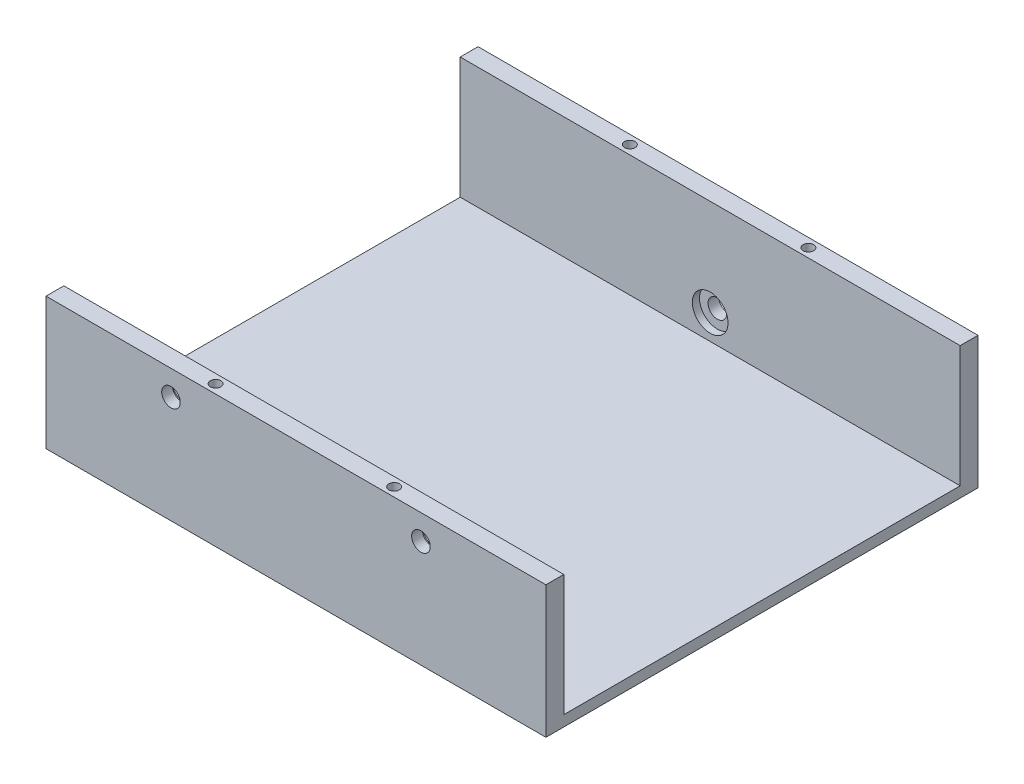
ISO-10303-21;
HEADER;
FILE_DESCRIPTION(('STEP AP214'),'2;1');
FILE_NAME('part.step','',(''),(''),'','','');
FILE_SCHEMA(('AUTOMOTIVE_DESIGN { 1 0 10303 214 1 1 1 1 }'));
ENDSEC;
DATA;
#1=APPLICATION_CONTEXT('core data for automotive mechanical design processes');
#2=APPLICATION_PROTOCOL_DEFINITION('international standard','automotive_design',2000,#1);
#3=PRODUCT_CONTEXT('',#1,'mechanical');
#4=PRODUCT('Part','Part','',(#3));
#5=PRODUCT_RELATED_PRODUCT_CATEGORY('part','',(#4));
#6=PRODUCT_DEFINITION_FORMATION('','',#4);
#7=PRODUCT_DEFINITION_CONTEXT('part definition',#1,'design');
#8=PRODUCT_DEFINITION('design','',#6,#7);
#9=PRODUCT_DEFINITION_SHAPE('','',#8);
#10=(LENGTH_UNIT() NAMED_UNIT(*) SI_UNIT(.MILLI.,.METRE.));
#11=(NAMED_UNIT(*) PLANE_ANGLE_UNIT() SI_UNIT($,.RADIAN.));
#12=(NAMED_UNIT(*) SI_UNIT($,.STERADIAN.) SOLID_ANGLE_UNIT());
#13=UNCERTAINTY_MEASURE_WITH_UNIT(LENGTH_MEASURE(1.E-05),#10,'distance_accuracy_value','');
#14=(GEOMETRIC_REPRESENTATION_CONTEXT(3) GLOBAL_UNCERTAINTY_ASSIGNED_CONTEXT((#13)) GLOBAL_UNIT_ASSIGNED_CONTEXT((#10,
#11,#12)) REPRESENTATION_CONTEXT('',''));
#15=CARTESIAN_POINT('',(0.,0.,0.));
#16=DIRECTION('',(0.,0.,1.));
#17=DIRECTION('',(1.,0.,0.));
#18=AXIS2_PLACEMENT_3D('',#15,#16,#17);
#19=CARTESIAN_POINT('',(150.,40.,-6.));
#20=DIRECTION('',(0.,0.,1.));
#21=DIRECTION('',(1.,0.,0.));
#22=AXIS2_PLACEMENT_3D('',#19,#20,#21);
#23=PLANE('',#22);
#24=CARTESIAN_POINT('',(35.,30.,-5.99999999999999));
#25=DIRECTION('',(0.,0.,-1.));
#26=DIRECTION('',(-1.,0.,0.));
#27=AXIS2_PLACEMENT_3D('',#24,#25,#26);
#28=CIRCLE('',#27,5.);
#29=CARTESIAN_POINT('',(30.,30.,-5.99999999999998));
#30=VERTEX_POINT('',#29);
#31=EDGE_CURVE('E175',#30,#30,#28,.T.);
#32=ORIENTED_EDGE('',*,*,#31,.F.);
#33=EDGE_LOOP('',(#32));
#34=FACE_BOUND('',#33,.T.);
#35=CARTESIAN_POINT('',(105.,30.,-5.99999999999999));
#36=DIRECTION('',(0.,0.,-1.));
#37=DIRECTION('',(-1.,0.,0.));
#38=AXIS2_PLACEMENT_3D('',#35,#36,#37);
#39=CIRCLE('',#38,5.00000000000001);
#40=CARTESIAN_POINT('',(100.,30.,-5.99999999999999));
#41=VERTEX_POINT('',#40);
#42=EDGE_CURVE('E176',#41,#41,#39,.T.);
#43=ORIENTED_EDGE('',*,*,#42,.F.);
#44=EDGE_LOOP('',(#43));
#45=FACE_BOUND('',#44,.T.);
#46=DIRECTION('',(-1.,0.,0.));
#47=VECTOR('',#46,1.);
#48=CARTESIAN_POINT('',(150.,3.,-6.));
#49=LINE('',#48,#47);
#50=CARTESIAN_POINT('',(140.,3.,-6.));
#51=VERTEX_POINT('',#50);
#52=CARTESIAN_POINT('',(0.,3.,-5.99999999999999));
#53=VERTEX_POINT('',#52);
#54=EDGE_CURVE('E104',#51,#53,#49,.T.);
#55=ORIENTED_EDGE('',*,*,#54,.T.);
#56=DIRECTION('',(0.,1.,0.));
#57=VECTOR('',#56,1.);
#58=CARTESIAN_POINT('',(0.,3.,-5.99999999999999));
#59=LINE('',#58,#57);
#60=CARTESIAN_POINT('',(0.,37.,-6.));
#61=VERTEX_POINT('',#60);
#62=EDGE_CURVE('E107',#53,#61,#59,.T.);
#63=ORIENTED_EDGE('',*,*,#62,.T.);
#64=DIRECTION('',(1.,0.,0.));
#65=VECTOR('',#64,1.);
#66=CARTESIAN_POINT('',(0.,37.,-6.));
#67=LINE('',#66,#65);
#68=CARTESIAN_POINT('',(140.,37.,-6.));
#69=VERTEX_POINT('',#68);
#70=EDGE_CURVE('E55',#61,#69,#67,.T.);
#71=ORIENTED_EDGE('',*,*,#70,.T.);
#72=DIRECTION('',(0.,-1.,0.));
#73=VECTOR('',#72,1.);
#74=CARTESIAN_POINT('',(140.,40.,-6.));
#75=LINE('',#74,#73);
#76=EDGE_CURVE('E110',#69,#51,#75,.T.);
#77=ORIENTED_EDGE('',*,*,#76,.T.);
#78=EDGE_LOOP('',(#55,#63,#71,#77));
#79=FACE_BOUND('',#78,.T.);
#80=ADVANCED_FACE('F40',(#34,#45,#79),#23,.F.);
#81=CARTESIAN_POINT('',(70.,10.,-123.));
#82=DIRECTION('',(0.,0.,1.));
#83=DIRECTION('',(1.,0.,0.));
#84=AXIS2_PLACEMENT_3D('',#81,#82,#83);
#85=CYLINDRICAL_SURFACE('',#84,2.6);
#86=CARTESIAN_POINT('',(70.,10.,-122.));
#87=DIRECTION('',(0.,0.,1.));
#88=DIRECTION('',(1.,0.,0.));
#89=AXIS2_PLACEMENT_3D('',#86,#87,#88);
#90=CIRCLE('',#89,2.6);
#91=CARTESIAN_POINT('',(72.6,10.,-122.));
#92=VERTEX_POINT('',#91);
#93=EDGE_CURVE('E156',#92,#92,#90,.F.);
#94=ORIENTED_EDGE('',*,*,#93,.T.);
#95=EDGE_LOOP('',(#94));
#96=FACE_BOUND('',#95,.T.);
#97=CARTESIAN_POINT('',(70.,10.,-119.));
#98=DIRECTION('',(0.,0.,1.));
#99=DIRECTION('',(1.,0.,0.));
#100=AXIS2_PLACEMENT_3D('',#97,#98,#99);
#101=CIRCLE('',#100,2.6);
#102=CARTESIAN_POINT('',(72.6,10.,-119.));
#103=VERTEX_POINT('',#102);
#104=EDGE_CURVE('E238',#103,#103,#101,.T.);
#105=ORIENTED_EDGE('',*,*,#104,.T.);
#106=EDGE_LOOP('',(#105));
#107=FACE_BOUND('',#106,.T.);
#108=ADVANCED_FACE('F221',(#96,#107),#85,.F.);
#109=CARTESIAN_POINT('',(35.,30.,31.));
#110=DIRECTION('',(0.,0.,-1.));
#111=DIRECTION('',(-1.,0.,0.));
#112=AXIS2_PLACEMENT_3D('',#109,#110,#111);
#113=CYLINDRICAL_SURFACE('',#112,2.6);
#114=CARTESIAN_POINT('',(35.,30.,-1.));
#115=DIRECTION('',(0.,0.,-1.));
#116=DIRECTION('',(-1.,0.,0.));
#117=AXIS2_PLACEMENT_3D('',#114,#115,#116);
#118=CIRCLE('',#117,2.6);
#119=CARTESIAN_POINT('',(32.4,30.,-1.));
#120=VERTEX_POINT('',#119);
#121=EDGE_CURVE('E143',#120,#120,#118,.F.);
#122=ORIENTED_EDGE('',*,*,#121,.T.);
#123=EDGE_LOOP('',(#122));
#124=FACE_BOUND('',#123,.T.);
#125=CARTESIAN_POINT('',(35.,30.,-3.99999999999998));
#126=DIRECTION('',(0.,0.,-1.));
#127=DIRECTION('',(-1.,0.,0.));
#128=AXIS2_PLACEMENT_3D('',#125,#126,#127);
#129=CIRCLE('',#128,2.6);
#130=CARTESIAN_POINT('',(32.4,30.,-3.99999999999998));
#131=VERTEX_POINT('',#130);
#132=EDGE_CURVE('E225',#131,#131,#129,.T.);
#133=ORIENTED_EDGE('',*,*,#132,.T.);
#134=EDGE_LOOP('',(#133));
#135=FACE_BOUND('',#134,.T.);
#136=ADVANCED_FACE('F217',(#124,#135),#113,.F.);
#137=CARTESIAN_POINT('',(105.,30.,31.));
#138=DIRECTION('',(0.,0.,-1.));
#139=DIRECTION('',(-1.,0.,0.));
#140=AXIS2_PLACEMENT_3D('',#137,#138,#139);
#141=CYLINDRICAL_SURFACE('',#140,2.6);
#142=CARTESIAN_POINT('',(105.,30.,-0.999999999999997));
#143=DIRECTION('',(0.,0.,-1.));
#144=DIRECTION('',(-1.,0.,0.));
#145=AXIS2_PLACEMENT_3D('',#142,#143,#144);
#146=CIRCLE('',#145,2.6);
#147=CARTESIAN_POINT('',(102.4,30.,-0.999999999999997));
#148=VERTEX_POINT('',#147);
#149=EDGE_CURVE('E140',#148,#148,#146,.F.);
#150=ORIENTED_EDGE('',*,*,#149,.T.);
#151=EDGE_LOOP('',(#150));
#152=FACE_BOUND('',#151,.T.);
#153=CARTESIAN_POINT('',(105.,30.,-3.99999999999999));
#154=DIRECTION('',(0.,0.,-1.));
#155=DIRECTION('',(-1.,0.,0.));
#156=AXIS2_PLACEMENT_3D('',#153,#154,#155);
#157=CIRCLE('',#156,2.6);
#158=CARTESIAN_POINT('',(102.4,30.,-3.99999999999999));
#159=VERTEX_POINT('',#158);
#160=EDGE_CURVE('E230',#159,#159,#157,.T.);
#161=ORIENTED_EDGE('',*,*,#160,.T.);
#162=EDGE_LOOP('',(#161));
#163=FACE_BOUND('',#162,.T.);
#164=ADVANCED_FACE('F220',(#152,#163),#141,.F.);
#165=CARTESIAN_POINT('',(0.,3.,0.));
#166=DIRECTION('',(0.,1.,0.));
#167=DIRECTION('',(0.,0.,1.));
#168=AXIS2_PLACEMENT_3D('',#165,#166,#167);
#169=PLANE('',#168);
#170=DIRECTION('',(0.,0.,-1.));
#171=VECTOR('',#170,1.);
#172=CARTESIAN_POINT('',(0.,3.,0.));
#173=LINE('',#172,#171);
#174=CARTESIAN_POINT('',(0.,3.,-117.));
#175=VERTEX_POINT('',#174);
#176=EDGE_CURVE('E11',#53,#175,#173,.T.);
#177=ORIENTED_EDGE('',*,*,#176,.F.);
#178=ORIENTED_EDGE('',*,*,#54,.F.);
#179=DIRECTION('',(0.,0.,1.));
#180=VECTOR('',#179,1.);
#181=CARTESIAN_POINT('',(140.,3.,0.));
#182=LINE('',#181,#180);
#183=CARTESIAN_POINT('',(140.,3.,-117.));
#184=VERTEX_POINT('',#183);
#185=EDGE_CURVE('E184',#184,#51,#182,.T.);
#186=ORIENTED_EDGE('',*,*,#185,.F.);
#187=DIRECTION('',(1.,0.,0.));
#188=VECTOR('',#187,1.);
#189=CARTESIAN_POINT('',(0.,3.,-117.));
#190=LINE('',#189,#188);
#191=EDGE_CURVE('E114',#175,#184,#190,.T.);
#192=ORIENTED_EDGE('',*,*,#191,.F.);
#193=EDGE_LOOP('',(#177,#178,#186,#192));
#194=FACE_BOUND('',#193,.T.);
#195=ADVANCED_FACE('F118',(#194),#169,.T.);
#196=CARTESIAN_POINT('',(0.,3.,0.));
#197=DIRECTION('',(-1.,0.,0.));
#198=DIRECTION('',(0.,0.,1.));
#199=AXIS2_PLACEMENT_3D('',#196,#197,#198);
#200=PLANE('',#199);
#201=ORIENTED_EDGE('',*,*,#62,.F.);
#202=ORIENTED_EDGE('',*,*,#176,.T.);
#203=DIRECTION('',(0.,-1.,0.));
#204=VECTOR('',#203,1.);
#205=CARTESIAN_POINT('',(0.,20.,-117.));
#206=LINE('',#205,#204);
#207=CARTESIAN_POINT('',(0.,37.,-117.));
#208=VERTEX_POINT('',#207);
#209=EDGE_CURVE('E188',#208,#175,#206,.T.);
#210=ORIENTED_EDGE('',*,*,#209,.F.);
#211=DIRECTION('',(0.,0.,1.));
#212=VECTOR('',#211,1.);
#213=CARTESIAN_POINT('',(0.,37.,-123.));
#214=LINE('',#213,#212);
#215=CARTESIAN_POINT('',(0.,37.,-122.));
#216=VERTEX_POINT('',#215);
#217=EDGE_CURVE('E159',#216,#208,#214,.T.);
#218=ORIENTED_EDGE('',*,*,#217,.F.);
#219=DIRECTION('',(0.,1.,0.));
#220=VECTOR('',#219,1.);
#221=CARTESIAN_POINT('',(0.,-13.,-122.));
#222=LINE('',#221,#220);
#223=CARTESIAN_POINT('',(0.,0.,-122.));
#224=VERTEX_POINT('',#223);
#225=EDGE_CURVE('E148',#224,#216,#222,.T.);
#226=ORIENTED_EDGE('',*,*,#225,.F.);
#227=DIRECTION('',(0.,0.,-1.));
#228=VECTOR('',#227,1.);
#229=CARTESIAN_POINT('',(0.,0.,0.));
#230=LINE('',#229,#228);
#231=CARTESIAN_POINT('',(0.,0.,-1.));
#232=VERTEX_POINT('',#231);
#233=EDGE_CURVE('E44',#232,#224,#230,.T.);
#234=ORIENTED_EDGE('',*,*,#233,.F.);
#235=DIRECTION('',(0.,1.,0.));
#236=VECTOR('',#235,1.);
#237=CARTESIAN_POINT('',(0.,-13.,-1.));
#238=LINE('',#237,#236);
#239=CARTESIAN_POINT('',(0.,37.,-1.));
#240=VERTEX_POINT('',#239);
#241=EDGE_CURVE('E134',#232,#240,#238,.T.);
#242=ORIENTED_EDGE('',*,*,#241,.T.);
#243=DIRECTION('',(0.,0.,1.));
#244=VECTOR('',#243,1.);
#245=CARTESIAN_POINT('',(0.,37.,-6.));
#246=LINE('',#245,#244);
#247=EDGE_CURVE('E124',#61,#240,#246,.T.);
#248=ORIENTED_EDGE('',*,*,#247,.F.);
#249=EDGE_LOOP('',(#201,#202,#210,#218,#226,#234,#242,#248));
#250=FACE_BOUND('',#249,.T.);
#251=ADVANCED_FACE('F42',(#250),#200,.T.);
#252=CARTESIAN_POINT('',(0.,0.,0.));
#253=DIRECTION('',(0.,1.,0.));
#254=DIRECTION('',(0.,0.,1.));
#255=AXIS2_PLACEMENT_3D('',#252,#253,#254);
#256=PLANE('',#255);
#257=DIRECTION('',(0.,0.,-1.));
#258=VECTOR('',#257,1.);
#259=CARTESIAN_POINT('',(140.,0.,0.));
#260=LINE('',#259,#258);
#261=CARTESIAN_POINT('',(140.,0.,-1.));
#262=VERTEX_POINT('',#261);
#263=CARTESIAN_POINT('',(140.,0.,-122.));
#264=VERTEX_POINT('',#263);
#265=EDGE_CURVE('E179',#262,#264,#260,.T.);
#266=ORIENTED_EDGE('',*,*,#265,.F.);
#267=DIRECTION('',(-1.,0.,0.));
#268=VECTOR('',#267,1.);
#269=CARTESIAN_POINT('',(0.,0.,-1.));
#270=LINE('',#269,#268);
#271=EDGE_CURVE('E136',#262,#232,#270,.T.);
#272=ORIENTED_EDGE('',*,*,#271,.T.);
#273=ORIENTED_EDGE('',*,*,#233,.T.);
#274=DIRECTION('',(1.,0.,0.));
#275=VECTOR('',#274,1.);
#276=CARTESIAN_POINT('',(0.,0.,-122.));
#277=LINE('',#276,#275);
#278=EDGE_CURVE('E152',#224,#264,#277,.T.);
#279=ORIENTED_EDGE('',*,*,#278,.T.);
#280=EDGE_LOOP('',(#266,#272,#273,#279));
#281=FACE_BOUND('',#280,.T.);
#282=ADVANCED_FACE('F195',(#281),#256,.F.);
#283=CARTESIAN_POINT('',(0.,20.,-117.));
#284=DIRECTION('',(0.,0.,-1.));
#285=DIRECTION('',(-1.,0.,0.));
#286=AXIS2_PLACEMENT_3D('',#283,#284,#285);
#287=PLANE('',#286);
#288=CARTESIAN_POINT('',(70.,10.,-117.));
#289=DIRECTION('',(0.,0.,1.));
#290=DIRECTION('',(1.,0.,0.));
#291=AXIS2_PLACEMENT_3D('',#288,#289,#290);
#292=CIRCLE('',#291,5.);
#293=CARTESIAN_POINT('',(75.,10.,-117.));
#294=VERTEX_POINT('',#293);
#295=EDGE_CURVE('E171',#294,#294,#292,.T.);
#296=ORIENTED_EDGE('',*,*,#295,.F.);
#297=EDGE_LOOP('',(#296));
#298=FACE_BOUND('',#297,.T.);
#299=ORIENTED_EDGE('',*,*,#191,.T.);
#300=DIRECTION('',(0.,1.,0.));
#301=VECTOR('',#300,1.);
#302=CARTESIAN_POINT('',(140.,20.,-117.));
#303=LINE('',#302,#301);
#304=CARTESIAN_POINT('',(140.,37.,-117.));
#305=VERTEX_POINT('',#304);
#306=EDGE_CURVE('E115',#184,#305,#303,.T.);
#307=ORIENTED_EDGE('',*,*,#306,.T.);
#308=DIRECTION('',(1.,0.,0.));
#309=VECTOR('',#308,1.);
#310=CARTESIAN_POINT('',(0.,37.,-117.));
#311=LINE('',#310,#309);
#312=EDGE_CURVE('E161',#208,#305,#311,.T.);
#313=ORIENTED_EDGE('',*,*,#312,.F.);
#314=ORIENTED_EDGE('',*,*,#209,.T.);
#315=EDGE_LOOP('',(#299,#307,#313,#314));
#316=FACE_BOUND('',#315,.T.);
#317=ADVANCED_FACE('F299',(#298,#316),#287,.F.);
#318=CARTESIAN_POINT('',(140.,50.,0.));
#319=DIRECTION('',(-1.,0.,0.));
#320=DIRECTION('',(0.,0.,1.));
#321=AXIS2_PLACEMENT_3D('',#318,#319,#320);
#322=PLANE('',#321);
#323=DIRECTION('',(0.,0.,1.));
#324=VECTOR('',#323,1.);
#325=CARTESIAN_POINT('',(140.,37.,-6.));
#326=LINE('',#325,#324);
#327=CARTESIAN_POINT('',(140.,37.,-1.));
#328=VERTEX_POINT('',#327);
#329=EDGE_CURVE('E168',#69,#328,#326,.T.);
#330=ORIENTED_EDGE('',*,*,#329,.T.);
#331=DIRECTION('',(0.,1.,0.));
#332=VECTOR('',#331,1.);
#333=CARTESIAN_POINT('',(140.,-13.,-1.));
#334=LINE('',#333,#332);
#335=EDGE_CURVE('E63',#262,#328,#334,.T.);
#336=ORIENTED_EDGE('',*,*,#335,.F.);
#337=ORIENTED_EDGE('',*,*,#265,.T.);
#338=DIRECTION('',(0.,1.,0.));
#339=VECTOR('',#338,1.);
#340=CARTESIAN_POINT('',(140.,-13.,-122.));
#341=LINE('',#340,#339);
#342=CARTESIAN_POINT('',(140.,37.,-122.));
#343=VERTEX_POINT('',#342);
#344=EDGE_CURVE('E149',#264,#343,#341,.T.);
#345=ORIENTED_EDGE('',*,*,#344,.T.);
#346=DIRECTION('',(0.,0.,-1.));
#347=VECTOR('',#346,1.);
#348=CARTESIAN_POINT('',(140.,37.,-123.));
#349=LINE('',#348,#347);
#350=EDGE_CURVE('E164',#305,#343,#349,.T.);
#351=ORIENTED_EDGE('',*,*,#350,.F.);
#352=ORIENTED_EDGE('',*,*,#306,.F.);
#353=ORIENTED_EDGE('',*,*,#185,.T.);
#354=ORIENTED_EDGE('',*,*,#76,.F.);
#355=EDGE_LOOP('',(#330,#336,#337,#345,#351,#352,#353,#354));
#356=FACE_BOUND('',#355,.T.);
#357=ADVANCED_FACE('F207',(#356),#322,.F.);
#358=CARTESIAN_POINT('',(105.,30.,-2.99999999999999));
#359=DIRECTION('',(0.,0.,-1.));
#360=DIRECTION('',(-1.,0.,0.));
#361=AXIS2_PLACEMENT_3D('',#358,#359,#360);
#362=CYLINDRICAL_SURFACE('',#361,5.00000000000001);
#363=CARTESIAN_POINT('',(105.,30.,-3.99999999999999));
#364=DIRECTION('',(0.,0.,-1.));
#365=DIRECTION('',(-1.,0.,0.));
#366=AXIS2_PLACEMENT_3D('',#363,#364,#365);
#367=CIRCLE('',#366,5.00000000000001);
#368=CARTESIAN_POINT('',(100.,30.,-3.99999999999999));
#369=VERTEX_POINT('',#368);
#370=EDGE_CURVE('E235',#369,#369,#367,.T.);
#371=ORIENTED_EDGE('',*,*,#370,.F.);
#372=EDGE_LOOP('',(#371));
#373=FACE_BOUND('',#372,.T.);
#374=ORIENTED_EDGE('',*,*,#42,.T.);
#375=EDGE_LOOP('',(#374));
#376=FACE_BOUND('',#375,.T.);
#377=ADVANCED_FACE('F399',(#373,#376),#362,.F.);
#378=CARTESIAN_POINT('',(35.,30.,-2.99999999999999));
#379=DIRECTION('',(0.,0.,-1.));
#380=DIRECTION('',(-1.,0.,0.));
#381=AXIS2_PLACEMENT_3D('',#378,#379,#380);
#382=CYLINDRICAL_SURFACE('',#381,5.);
#383=CARTESIAN_POINT('',(35.,30.,-3.99999999999998));
#384=DIRECTION('',(0.,0.,-1.));
#385=DIRECTION('',(-1.,0.,0.));
#386=AXIS2_PLACEMENT_3D('',#383,#384,#385);
#387=CIRCLE('',#386,5.00000000000001);
#388=CARTESIAN_POINT('',(30.,30.,-3.99999999999998));
#389=VERTEX_POINT('',#388);
#390=EDGE_CURVE('E227',#389,#389,#387,.T.);
#391=ORIENTED_EDGE('',*,*,#390,.F.);
#392=EDGE_LOOP('',(#391));
#393=FACE_BOUND('',#392,.T.);
#394=ORIENTED_EDGE('',*,*,#31,.T.);
#395=EDGE_LOOP('',(#394));
#396=FACE_BOUND('',#395,.T.);
#397=ADVANCED_FACE('F348',(#393,#396),#382,.F.);
#398=CARTESIAN_POINT('',(70.,10.,-120.));
#399=DIRECTION('',(0.,0.,1.));
#400=DIRECTION('',(1.,0.,0.));
#401=AXIS2_PLACEMENT_3D('',#398,#399,#400);
#402=CYLINDRICAL_SURFACE('',#401,5.);
#403=CARTESIAN_POINT('',(70.,10.,-119.));
#404=DIRECTION('',(0.,0.,1.));
#405=DIRECTION('',(1.,0.,0.));
#406=AXIS2_PLACEMENT_3D('',#403,#404,#405);
#407=CIRCLE('',#406,5.);
#408=CARTESIAN_POINT('',(75.,10.,-119.));
#409=VERTEX_POINT('',#408);
#410=EDGE_CURVE('E241',#409,#409,#407,.T.);
#411=ORIENTED_EDGE('',*,*,#410,.F.);
#412=EDGE_LOOP('',(#411));
#413=FACE_BOUND('',#412,.T.);
#414=ORIENTED_EDGE('',*,*,#295,.T.);
#415=EDGE_LOOP('',(#414));
#416=FACE_BOUND('',#415,.T.);
#417=ADVANCED_FACE('F267',(#413,#416),#402,.F.);
#418=CARTESIAN_POINT('',(0.,37.,-6.));
#419=DIRECTION('',(0.,-1.,0.));
#420=DIRECTION('',(0.,0.,-1.));
#421=AXIS2_PLACEMENT_3D('',#418,#419,#420);
#422=PLANE('',#421);
#423=CARTESIAN_POINT('',(45.,37.,-3.49999999999999));
#424=DIRECTION('',(0.,1.,0.));
#425=DIRECTION('',(0.,0.,1.));
#426=AXIS2_PLACEMENT_3D('',#423,#424,#425);
#427=CIRCLE('',#426,1.48);
#428=CARTESIAN_POINT('',(45.,37.,-2.01999999999999));
#429=VERTEX_POINT('',#428);
#430=EDGE_CURVE('E248',#429,#429,#427,.T.);
#431=ORIENTED_EDGE('',*,*,#430,.F.);
#432=EDGE_LOOP('',(#431));
#433=FACE_BOUND('',#432,.T.);
#434=CARTESIAN_POINT('',(95.,37.,-3.5));
#435=DIRECTION('',(0.,1.,0.));
#436=DIRECTION('',(0.,0.,1.));
#437=AXIS2_PLACEMENT_3D('',#434,#435,#436);
#438=CIRCLE('',#437,1.47999999999999);
#439=CARTESIAN_POINT('',(95.,37.,-2.02000000000001));
#440=VERTEX_POINT('',#439);
#441=EDGE_CURVE('E244',#440,#440,#438,.T.);
#442=ORIENTED_EDGE('',*,*,#441,.F.);
#443=EDGE_LOOP('',(#442));
#444=FACE_BOUND('',#443,.T.);
#445=ORIENTED_EDGE('',*,*,#70,.F.);
#446=ORIENTED_EDGE('',*,*,#247,.T.);
#447=DIRECTION('',(-1.,0.,0.));
#448=VECTOR('',#447,1.);
#449=CARTESIAN_POINT('',(0.,37.,-1.));
#450=LINE('',#449,#448);
#451=EDGE_CURVE('E125',#328,#240,#450,.T.);
#452=ORIENTED_EDGE('',*,*,#451,.F.);
#453=ORIENTED_EDGE('',*,*,#329,.F.);
#454=EDGE_LOOP('',(#445,#446,#452,#453));
#455=FACE_BOUND('',#454,.T.);
#456=ADVANCED_FACE('F208',(#433,#444,#455),#422,.F.);
#457=CARTESIAN_POINT('',(0.,37.,0.));
#458=DIRECTION('',(0.,1.,0.));
#459=DIRECTION('',(0.,0.,1.));
#460=AXIS2_PLACEMENT_3D('',#457,#458,#459);
#461=PLANE('',#460);
#462=CARTESIAN_POINT('',(95.,37.,-119.5));
#463=DIRECTION('',(0.,1.,0.));
#464=DIRECTION('',(0.,0.,1.));
#465=AXIS2_PLACEMENT_3D('',#462,#463,#464);
#466=CIRCLE('',#465,1.47999999999999);
#467=CARTESIAN_POINT('',(95.,37.,-118.02));
#468=VERTEX_POINT('',#467);
#469=EDGE_CURVE('E254',#468,#468,#466,.T.);
#470=ORIENTED_EDGE('',*,*,#469,.F.);
#471=EDGE_LOOP('',(#470));
#472=FACE_BOUND('',#471,.T.);
#473=CARTESIAN_POINT('',(45.,37.,-119.5));
#474=DIRECTION('',(0.,1.,0.));
#475=DIRECTION('',(0.,0.,1.));
#476=AXIS2_PLACEMENT_3D('',#473,#474,#475);
#477=CIRCLE('',#476,1.48);
#478=CARTESIAN_POINT('',(45.,37.,-118.02));
#479=VERTEX_POINT('',#478);
#480=EDGE_CURVE('E130',#479,#479,#477,.T.);
#481=ORIENTED_EDGE('',*,*,#480,.F.);
#482=EDGE_LOOP('',(#481));
#483=FACE_BOUND('',#482,.T.);
#484=DIRECTION('',(1.,0.,0.));
#485=VECTOR('',#484,1.);
#486=CARTESIAN_POINT('',(0.,37.,-122.));
#487=LINE('',#486,#485);
#488=EDGE_CURVE('E146',#216,#343,#487,.T.);
#489=ORIENTED_EDGE('',*,*,#488,.F.);
#490=ORIENTED_EDGE('',*,*,#217,.T.);
#491=ORIENTED_EDGE('',*,*,#312,.T.);
#492=ORIENTED_EDGE('',*,*,#350,.T.);
#493=EDGE_LOOP('',(#489,#490,#491,#492));
#494=FACE_BOUND('',#493,.T.);
#495=ADVANCED_FACE('F204',(#472,#483,#494),#461,.T.);
#496=CARTESIAN_POINT('',(0.,-13.,-122.));
#497=DIRECTION('',(0.,0.,1.));
#498=DIRECTION('',(1.,0.,0.));
#499=AXIS2_PLACEMENT_3D('',#496,#497,#498);
#500=PLANE('',#499);
#501=ORIENTED_EDGE('',*,*,#225,.T.);
#502=ORIENTED_EDGE('',*,*,#488,.T.);
#503=ORIENTED_EDGE('',*,*,#344,.F.);
#504=ORIENTED_EDGE('',*,*,#278,.F.);
#505=EDGE_LOOP('',(#501,#502,#503,#504));
#506=FACE_BOUND('',#505,.T.);
#507=ORIENTED_EDGE('',*,*,#93,.F.);
#508=EDGE_LOOP('',(#507));
#509=FACE_BOUND('',#508,.T.);
#510=ADVANCED_FACE('F199',(#506,#509),#500,.F.);
#511=CARTESIAN_POINT('',(0.,-13.,-1.));
#512=DIRECTION('',(0.,0.,-1.));
#513=DIRECTION('',(-1.,0.,0.));
#514=AXIS2_PLACEMENT_3D('',#511,#512,#513);
#515=PLANE('',#514);
#516=ORIENTED_EDGE('',*,*,#149,.F.);
#517=EDGE_LOOP('',(#516));
#518=FACE_BOUND('',#517,.T.);
#519=ORIENTED_EDGE('',*,*,#335,.T.);
#520=ORIENTED_EDGE('',*,*,#451,.T.);
#521=ORIENTED_EDGE('',*,*,#241,.F.);
#522=ORIENTED_EDGE('',*,*,#271,.F.);
#523=EDGE_LOOP('',(#519,#520,#521,#522));
#524=FACE_BOUND('',#523,.T.);
#525=ORIENTED_EDGE('',*,*,#121,.F.);
#526=EDGE_LOOP('',(#525));
#527=FACE_BOUND('',#526,.T.);
#528=ADVANCED_FACE('F209',(#518,#524,#527),#515,.F.);
#529=CARTESIAN_POINT('',(45.,27.,-119.5));
#530=DIRECTION('',(0.,1.,0.));
#531=DIRECTION('',(0.,0.,1.));
#532=AXIS2_PLACEMENT_3D('',#529,#530,#531);
#533=CYLINDRICAL_SURFACE('',#532,1.48);
#534=CARTESIAN_POINT('',(45.,27.,-119.5));
#535=DIRECTION('',(0.,1.,0.));
#536=DIRECTION('',(0.,0.,1.));
#537=AXIS2_PLACEMENT_3D('',#534,#535,#536);
#538=CIRCLE('',#537,1.48);
#539=CARTESIAN_POINT('',(45.,27.,-118.02));
#540=VERTEX_POINT('',#539);
#541=EDGE_CURVE('E126',#540,#540,#538,.T.);
#542=ORIENTED_EDGE('',*,*,#541,.F.);
#543=EDGE_LOOP('',(#542));
#544=FACE_BOUND('',#543,.T.);
#545=ORIENTED_EDGE('',*,*,#480,.T.);
#546=EDGE_LOOP('',(#545));
#547=FACE_BOUND('',#546,.T.);
#548=ADVANCED_FACE('F212',(#544,#547),#533,.F.);
#549=CARTESIAN_POINT('',(0.,27.,0.));
#550=DIRECTION('',(0.,1.,0.));
#551=DIRECTION('',(0.,0.,1.));
#552=AXIS2_PLACEMENT_3D('',#549,#550,#551);
#553=PLANE('',#552);
#554=ORIENTED_EDGE('',*,*,#541,.T.);
#555=EDGE_LOOP('',(#554));
#556=FACE_BOUND('',#555,.T.);
#557=ADVANCED_FACE('F486',(#556),#553,.T.);
#558=CARTESIAN_POINT('',(95.,27.,-119.5));
#559=DIRECTION('',(0.,1.,0.));
#560=DIRECTION('',(0.,0.,1.));
#561=AXIS2_PLACEMENT_3D('',#558,#559,#560);
#562=CYLINDRICAL_SURFACE('',#561,1.47999999999999);
#563=CARTESIAN_POINT('',(95.,27.,-119.5));
#564=DIRECTION('',(0.,1.,0.));
#565=DIRECTION('',(0.,0.,1.));
#566=AXIS2_PLACEMENT_3D('',#563,#564,#565);
#567=CIRCLE('',#566,1.47999999999999);
#568=CARTESIAN_POINT('',(95.,27.,-118.02));
#569=VERTEX_POINT('',#568);
#570=EDGE_CURVE('E251',#569,#569,#567,.T.);
#571=ORIENTED_EDGE('',*,*,#570,.F.);
#572=EDGE_LOOP('',(#571));
#573=FACE_BOUND('',#572,.T.);
#574=ORIENTED_EDGE('',*,*,#469,.T.);
#575=EDGE_LOOP('',(#574));
#576=FACE_BOUND('',#575,.T.);
#577=ADVANCED_FACE('F283',(#573,#576),#562,.F.);
#578=CARTESIAN_POINT('',(0.,27.,0.));
#579=DIRECTION('',(0.,1.,0.));
#580=DIRECTION('',(0.,0.,1.));
#581=AXIS2_PLACEMENT_3D('',#578,#579,#580);
#582=PLANE('',#581);
#583=ORIENTED_EDGE('',*,*,#570,.T.);
#584=EDGE_LOOP('',(#583));
#585=FACE_BOUND('',#584,.T.);
#586=ADVANCED_FACE('F274',(#585),#582,.T.);
#587=CARTESIAN_POINT('',(95.,27.,-3.5));
#588=DIRECTION('',(0.,1.,0.));
#589=DIRECTION('',(0.,0.,1.));
#590=AXIS2_PLACEMENT_3D('',#587,#588,#589);
#591=CYLINDRICAL_SURFACE('',#590,1.47999999999999);
#592=CARTESIAN_POINT('',(95.,27.,-3.5));
#593=DIRECTION('',(0.,1.,0.));
#594=DIRECTION('',(0.,0.,1.));
#595=AXIS2_PLACEMENT_3D('',#592,#593,#594);
#596=CIRCLE('',#595,1.47999999999999);
#597=CARTESIAN_POINT('',(95.,27.,-2.02000000000001));
#598=VERTEX_POINT('',#597);
#599=EDGE_CURVE('E245',#598,#598,#596,.T.);
#600=ORIENTED_EDGE('',*,*,#599,.F.);
#601=EDGE_LOOP('',(#600));
#602=FACE_BOUND('',#601,.T.);
#603=ORIENTED_EDGE('',*,*,#441,.T.);
#604=EDGE_LOOP('',(#603));
#605=FACE_BOUND('',#604,.T.);
#606=ADVANCED_FACE('F271',(#602,#605),#591,.F.);
#607=CARTESIAN_POINT('',(0.,27.,0.));
#608=DIRECTION('',(0.,1.,0.));
#609=DIRECTION('',(0.,0.,1.));
#610=AXIS2_PLACEMENT_3D('',#607,#608,#609);
#611=PLANE('',#610);
#612=ORIENTED_EDGE('',*,*,#599,.T.);
#613=EDGE_LOOP('',(#612));
#614=FACE_BOUND('',#613,.T.);
#615=ADVANCED_FACE('F273',(#614),#611,.T.);
#616=CARTESIAN_POINT('',(45.,27.,-3.49999999999999));
#617=DIRECTION('',(0.,1.,0.));
#618=DIRECTION('',(0.,0.,1.));
#619=AXIS2_PLACEMENT_3D('',#616,#617,#618);
#620=CYLINDRICAL_SURFACE('',#619,1.48);
#621=CARTESIAN_POINT('',(45.,27.,-3.49999999999999));
#622=DIRECTION('',(0.,1.,0.));
#623=DIRECTION('',(0.,0.,1.));
#624=AXIS2_PLACEMENT_3D('',#621,#622,#623);
#625=CIRCLE('',#624,1.48);
#626=CARTESIAN_POINT('',(45.,27.,-2.01999999999999));
#627=VERTEX_POINT('',#626);
#628=EDGE_CURVE('E257',#627,#627,#625,.T.);
#629=ORIENTED_EDGE('',*,*,#628,.F.);
#630=EDGE_LOOP('',(#629));
#631=FACE_BOUND('',#630,.T.);
#632=ORIENTED_EDGE('',*,*,#430,.T.);
#633=EDGE_LOOP('',(#632));
#634=FACE_BOUND('',#633,.T.);
#635=ADVANCED_FACE('F263',(#631,#634),#620,.F.);
#636=CARTESIAN_POINT('',(0.,27.,0.));
#637=DIRECTION('',(0.,1.,0.));
#638=DIRECTION('',(0.,0.,1.));
#639=AXIS2_PLACEMENT_3D('',#636,#637,#638);
#640=PLANE('',#639);
#641=ORIENTED_EDGE('',*,*,#628,.T.);
#642=EDGE_LOOP('',(#641));
#643=FACE_BOUND('',#642,.T.);
#644=ADVANCED_FACE('F341',(#643),#640,.T.);
#645=CARTESIAN_POINT('',(70.,10.,-119.));
#646=DIRECTION('',(0.,0.,1.));
#647=DIRECTION('',(1.,0.,0.));
#648=AXIS2_PLACEMENT_3D('',#645,#646,#647);
#649=PLANE('',#648);
#650=ORIENTED_EDGE('',*,*,#410,.T.);
#651=EDGE_LOOP('',(#650));
#652=FACE_BOUND('',#651,.T.);
#653=ORIENTED_EDGE('',*,*,#104,.F.);
#654=EDGE_LOOP('',(#653));
#655=FACE_BOUND('',#654,.T.);
#656=ADVANCED_FACE('F356',(#652,#655),#649,.T.);
#657=CARTESIAN_POINT('',(105.,30.,-3.99999999999999));
#658=DIRECTION('',(0.,0.,-1.));
#659=DIRECTION('',(-1.,0.,0.));
#660=AXIS2_PLACEMENT_3D('',#657,#658,#659);
#661=PLANE('',#660);
#662=ORIENTED_EDGE('',*,*,#370,.T.);
#663=EDGE_LOOP('',(#662));
#664=FACE_BOUND('',#663,.T.);
#665=ORIENTED_EDGE('',*,*,#160,.F.);
#666=EDGE_LOOP('',(#665));
#667=FACE_BOUND('',#666,.T.);
#668=ADVANCED_FACE('F359',(#664,#667),#661,.T.);
#669=CARTESIAN_POINT('',(35.,30.,-3.99999999999998));
#670=DIRECTION('',(0.,0.,-1.));
#671=DIRECTION('',(-1.,0.,0.));
#672=AXIS2_PLACEMENT_3D('',#669,#670,#671);
#673=PLANE('',#672);
#674=ORIENTED_EDGE('',*,*,#390,.T.);
#675=EDGE_LOOP('',(#674));
#676=FACE_BOUND('',#675,.T.);
#677=ORIENTED_EDGE('',*,*,#132,.F.);
#678=EDGE_LOOP('',(#677));
#679=FACE_BOUND('',#678,.T.);
#680=ADVANCED_FACE('F371',(#676,#679),#673,.T.);
#681=CLOSED_SHELL('',(#80,#108,#136,#164,#195,#251,#282,#317,#357,#377,#397,#417,#456,#495,#510,
#528,#548,#557,#577,#586,#606,#615,#635,#644,#656,#668,#680));
#682=MANIFOLD_SOLID_BREP('B2',#681);
#683=ADVANCED_BREP_SHAPE_REPRESENTATION('',(#18,#682),#14);
#684=SHAPE_DEFINITION_REPRESENTATION(#9,#683);
ENDSEC;
END-ISO-10303-21;
